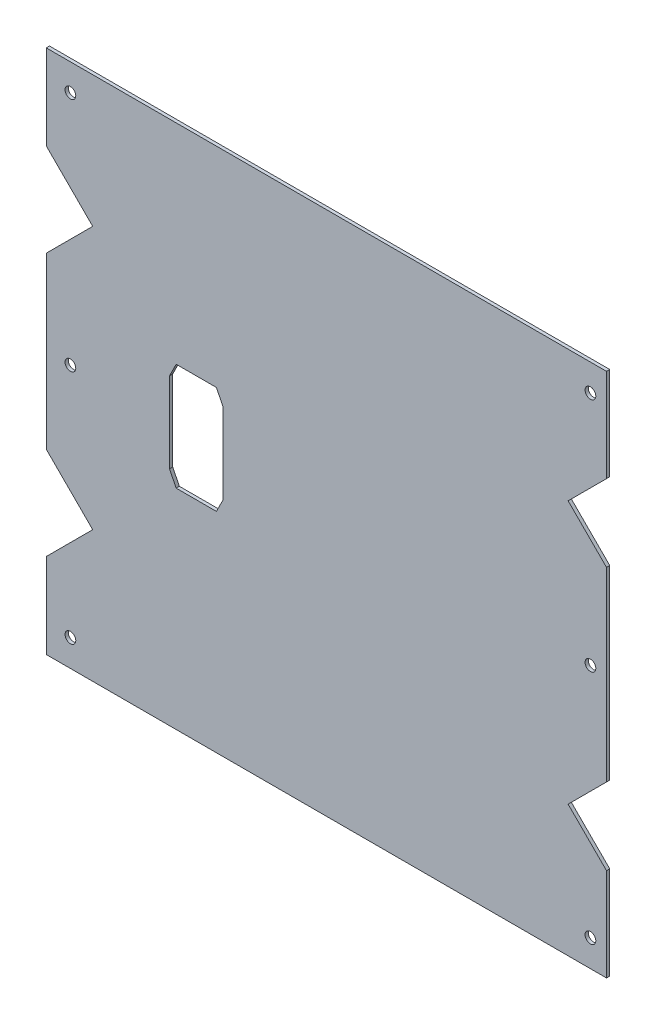
ISO-10303-21;
HEADER;
FILE_DESCRIPTION(('STEP AP214'),'2;1');
FILE_NAME('part.step','',(''),(''),'','','');
FILE_SCHEMA(('AUTOMOTIVE_DESIGN { 1 0 10303 214 1 1 1 1 }'));
ENDSEC;
DATA;
#1=APPLICATION_CONTEXT('core data for automotive mechanical design processes');
#2=APPLICATION_PROTOCOL_DEFINITION('international standard','automotive_design',2000,#1);
#3=PRODUCT_CONTEXT('',#1,'mechanical');
#4=PRODUCT('Part','Part','',(#3));
#5=PRODUCT_RELATED_PRODUCT_CATEGORY('part','',(#4));
#6=PRODUCT_DEFINITION_FORMATION('','',#4);
#7=PRODUCT_DEFINITION_CONTEXT('part definition',#1,'design');
#8=PRODUCT_DEFINITION('design','',#6,#7);
#9=PRODUCT_DEFINITION_SHAPE('','',#8);
#10=(LENGTH_UNIT() NAMED_UNIT(*) SI_UNIT(.MILLI.,.METRE.));
#11=(NAMED_UNIT(*) PLANE_ANGLE_UNIT() SI_UNIT($,.RADIAN.));
#12=(NAMED_UNIT(*) SI_UNIT($,.STERADIAN.) SOLID_ANGLE_UNIT());
#13=UNCERTAINTY_MEASURE_WITH_UNIT(LENGTH_MEASURE(1.E-05),#10,'distance_accuracy_value','');
#14=(GEOMETRIC_REPRESENTATION_CONTEXT(3) GLOBAL_UNCERTAINTY_ASSIGNED_CONTEXT((#13)) GLOBAL_UNIT_ASSIGNED_CONTEXT((#10,
#11,#12)) REPRESENTATION_CONTEXT('',''));
#15=CARTESIAN_POINT('',(0.,0.,0.));
#16=DIRECTION('',(0.,0.,1.));
#17=DIRECTION('',(1.,0.,0.));
#18=AXIS2_PLACEMENT_3D('',#15,#16,#17);
#19=CARTESIAN_POINT('',(0.,0.,-1.2));
#20=DIRECTION('',(0.,0.,-1.));
#21=DIRECTION('',(-1.,0.,0.));
#22=AXIS2_PLACEMENT_3D('',#19,#20,#21);
#23=PLANE('',#22);
#24=DIRECTION('',(0.707106781186546,0.707106781186549,0.));
#25=VECTOR('',#24,1.);
#26=CARTESIAN_POINT('',(-112.74800186836,24.8232233047034,-1.19999999999985));
#27=LINE('',#26,#25);
#28=CARTESIAN_POINT('',(-105.924778563656,31.6464466094066,-1.19999999999988));
#29=VERTEX_POINT('',#28);
#30=CARTESIAN_POINT('',(-88.6088358912349,48.9623892818282,-1.2));
#31=VERTEX_POINT('',#30);
#32=EDGE_CURVE('E1218',#29,#31,#27,.T.);
#33=ORIENTED_EDGE('',*,*,#32,.T.);
#34=DIRECTION('',(0.707106781186546,-0.707106781186549,0.));
#35=VECTOR('',#34,1.);
#36=CARTESIAN_POINT('',(-112.748001868359,73.1015552589529,-1.19999999999972));
#37=LINE('',#36,#35);
#38=CARTESIAN_POINT('',(-105.924778563656,66.2783319542498,-1.19999999999982));
#39=VERTEX_POINT('',#38);
#40=EDGE_CURVE('E1199',#39,#31,#37,.T.);
#41=ORIENTED_EDGE('',*,*,#40,.F.);
#42=DIRECTION('',(0.,-1.,0.));
#43=VECTOR('',#42,1.);
#44=CARTESIAN_POINT('',(-105.924778563656,47.9247785636563,-1.19999999999994));
#45=LINE('',#44,#43);
#46=CARTESIAN_POINT('',(-105.924778563656,97.9247785636565,-1.1999999999996));
#47=VERTEX_POINT('',#46);
#48=EDGE_CURVE('E1214',#39,#47,#45,.F.);
#49=ORIENTED_EDGE('',*,*,#48,.T.);
#50=DIRECTION('',(-1.,0.,0.));
#51=VECTOR('',#50,1.);
#52=CARTESIAN_POINT('',(137.924778563656,97.9247785636564,-1.19999999999937));
#53=LINE('',#52,#51);
#54=CARTESIAN_POINT('',(102.924778563656,97.9247785636564,-1.1999999999996));
#55=VERTEX_POINT('',#54);
#56=EDGE_CURVE('E1235',#47,#55,#53,.F.);
#57=ORIENTED_EDGE('',*,*,#56,.T.);
#58=DIRECTION('',(0.,1.,0.));
#59=VECTOR('',#58,1.);
#60=CARTESIAN_POINT('',(102.924778563656,47.9247785636563,-1.19999999999994));
#61=LINE('',#60,#59);
#62=CARTESIAN_POINT('',(102.924778563656,63.2783319542498,-1.19999999999983));
#63=VERTEX_POINT('',#62);
#64=EDGE_CURVE('E1229',#55,#63,#61,.F.);
#65=ORIENTED_EDGE('',*,*,#64,.T.);
#66=DIRECTION('',(0.707106781186546,0.707106781186549,0.));
#67=VECTOR('',#66,1.);
#68=CARTESIAN_POINT('',(112.748001868359,73.1015552589529,-1.19999999999969));
#69=LINE('',#68,#67);
#70=CARTESIAN_POINT('',(88.6088358912349,48.9623892818282,-1.20000000000002));
#71=VERTEX_POINT('',#70);
#72=EDGE_CURVE('E1223',#71,#63,#69,.T.);
#73=ORIENTED_EDGE('',*,*,#72,.F.);
#74=DIRECTION('',(0.707106781186546,-0.707106781186549,0.));
#75=VECTOR('',#74,1.);
#76=CARTESIAN_POINT('',(112.74800186836,24.8232233047034,-1.19999999999987));
#77=LINE('',#76,#75);
#78=CARTESIAN_POINT('',(102.924778563656,34.6464466094066,-1.19999999999994));
#79=VERTEX_POINT('',#78);
#80=EDGE_CURVE('E1321',#71,#79,#77,.T.);
#81=ORIENTED_EDGE('',*,*,#80,.T.);
#82=DIRECTION('',(0.,-1.,0.));
#83=VECTOR('',#82,1.);
#84=CARTESIAN_POINT('',(102.924778563656,0.,-1.19999999999994));
#85=LINE('',#84,#83);
#86=CARTESIAN_POINT('',(102.924778563656,-34.6464466094067,-1.19999999999997));
#87=VERTEX_POINT('',#86);
#88=EDGE_CURVE('E1327',#79,#87,#85,.T.);
#89=ORIENTED_EDGE('',*,*,#88,.T.);
#90=DIRECTION('',(-0.707106781186546,-0.707106781186549,0.));
#91=VECTOR('',#90,1.);
#92=CARTESIAN_POINT('',(112.74800186836,-24.8232233047034,-1.19999999999988));
#93=LINE('',#92,#91);
#94=CARTESIAN_POINT('',(88.6088358912349,-48.9623892818282,-1.20000000000005));
#95=VERTEX_POINT('',#94);
#96=EDGE_CURVE('E1324',#87,#95,#93,.T.);
#97=ORIENTED_EDGE('',*,*,#96,.T.);
#98=DIRECTION('',(0.707106781186546,-0.707106781186549,0.));
#99=VECTOR('',#98,1.);
#100=CARTESIAN_POINT('',(112.748001868359,-73.1015552589529,-1.19999999999969));
#101=LINE('',#100,#99);
#102=CARTESIAN_POINT('',(102.924778563656,-63.2783319542498,-1.19999999999984));
#103=VERTEX_POINT('',#102);
#104=EDGE_CURVE('E1279',#95,#103,#101,.T.);
#105=ORIENTED_EDGE('',*,*,#104,.T.);
#106=DIRECTION('',(0.,-1.,0.));
#107=VECTOR('',#106,1.);
#108=CARTESIAN_POINT('',(102.924778563656,-47.9247785636563,-1.19999999999995));
#109=LINE('',#108,#107);
#110=CARTESIAN_POINT('',(102.924778563656,-97.9247785636565,-1.1999999999996));
#111=VERTEX_POINT('',#110);
#112=EDGE_CURVE('E1276',#103,#111,#109,.T.);
#113=ORIENTED_EDGE('',*,*,#112,.T.);
#114=DIRECTION('',(-1.,0.,0.));
#115=VECTOR('',#114,1.);
#116=CARTESIAN_POINT('',(137.924778563656,-97.9247785636564,-1.19999999999936));
#117=LINE('',#116,#115);
#118=CARTESIAN_POINT('',(-105.924778563656,-97.9247785636565,-1.19999999999955));
#119=VERTEX_POINT('',#118);
#120=EDGE_CURVE('E1273',#111,#119,#117,.T.);
#121=ORIENTED_EDGE('',*,*,#120,.T.);
#122=DIRECTION('',(0.,1.,0.));
#123=VECTOR('',#122,1.);
#124=CARTESIAN_POINT('',(-105.924778563656,-47.9247785636563,-1.19999999999989));
#125=LINE('',#124,#123);
#126=CARTESIAN_POINT('',(-105.924778563656,-66.2783319542498,-1.19999999999976));
#127=VERTEX_POINT('',#126);
#128=EDGE_CURVE('E1270',#119,#127,#125,.T.);
#129=ORIENTED_EDGE('',*,*,#128,.T.);
#130=DIRECTION('',(0.707106781186546,0.707106781186549,0.));
#131=VECTOR('',#130,1.);
#132=CARTESIAN_POINT('',(-112.748001868359,-73.1015552589528,-1.19999999999966));
#133=LINE('',#132,#131);
#134=CARTESIAN_POINT('',(-88.6088358912349,-48.9623892818282,-1.19999999999999));
#135=VERTEX_POINT('',#134);
#136=EDGE_CURVE('E1267',#127,#135,#133,.T.);
#137=ORIENTED_EDGE('',*,*,#136,.T.);
#138=DIRECTION('',(-0.707106781186546,0.707106781186549,0.));
#139=VECTOR('',#138,1.);
#140=CARTESIAN_POINT('',(-112.74800186836,-24.8232233047034,-1.19999999999987));
#141=LINE('',#140,#139);
#142=CARTESIAN_POINT('',(-105.924778563656,-31.6464466094066,-1.19999999999991));
#143=VERTEX_POINT('',#142);
#144=EDGE_CURVE('E1352',#135,#143,#141,.T.);
#145=ORIENTED_EDGE('',*,*,#144,.T.);
#146=DIRECTION('',(0.,1.,0.));
#147=VECTOR('',#146,1.);
#148=CARTESIAN_POINT('',(-105.924778563656,0.,-1.1999999999999));
#149=LINE('',#148,#147);
#150=EDGE_CURVE('E1356',#143,#29,#149,.T.);
#151=ORIENTED_EDGE('',*,*,#150,.T.);
#152=EDGE_LOOP('',(#33,#41,#49,#57,#65,#73,#81,#89,#97,#105,#113,#121,#129,#137,#145,#151));
#153=FACE_BOUND('',#152,.T.);
#154=DIRECTION('',(1.,0.,0.));
#155=VECTOR('',#154,1.);
#156=CARTESIAN_POINT('',(0.,20.,-1.2));
#157=LINE('',#156,#155);
#158=CARTESIAN_POINT('',(-57.5,20.,-1.2));
#159=VERTEX_POINT('',#158);
#160=CARTESIAN_POINT('',(-42.5,20.,-1.2));
#161=VERTEX_POINT('',#160);
#162=EDGE_CURVE('E618',#159,#161,#157,.T.);
#163=ORIENTED_EDGE('',*,*,#162,.F.);
#164=DIRECTION('',(0.447213595499958,0.894427190999916,0.));
#165=VECTOR('',#164,1.);
#166=CARTESIAN_POINT('',(-54.,27.,-1.2));
#167=LINE('',#166,#165);
#168=CARTESIAN_POINT('',(-60.,15.,-1.20000000000001));
#169=VERTEX_POINT('',#168);
#170=EDGE_CURVE('E654',#169,#159,#167,.T.);
#171=ORIENTED_EDGE('',*,*,#170,.F.);
#172=DIRECTION('',(0.,1.,0.));
#173=VECTOR('',#172,1.);
#174=CARTESIAN_POINT('',(-60.,0.,-1.2));
#175=LINE('',#174,#173);
#176=CARTESIAN_POINT('',(-60.,-15.,-1.2));
#177=VERTEX_POINT('',#176);
#178=EDGE_CURVE('E656',#177,#169,#175,.T.);
#179=ORIENTED_EDGE('',*,*,#178,.F.);
#180=DIRECTION('',(-0.447213595499958,0.894427190999916,0.));
#181=VECTOR('',#180,1.);
#182=CARTESIAN_POINT('',(-54.,-27.,-1.2));
#183=LINE('',#182,#181);
#184=CARTESIAN_POINT('',(-57.5,-20.,-1.2));
#185=VERTEX_POINT('',#184);
#186=EDGE_CURVE('E672',#185,#177,#183,.T.);
#187=ORIENTED_EDGE('',*,*,#186,.F.);
#188=DIRECTION('',(-1.,0.,0.));
#189=VECTOR('',#188,1.);
#190=CARTESIAN_POINT('',(0.,-20.,-1.2));
#191=LINE('',#190,#189);
#192=CARTESIAN_POINT('',(-42.5,-20.,-1.2));
#193=VERTEX_POINT('',#192);
#194=EDGE_CURVE('E675',#193,#185,#191,.T.);
#195=ORIENTED_EDGE('',*,*,#194,.F.);
#196=DIRECTION('',(-0.447213595499958,-0.894427190999916,0.));
#197=VECTOR('',#196,1.);
#198=CARTESIAN_POINT('',(-26.,13.,-1.2));
#199=LINE('',#198,#197);
#200=CARTESIAN_POINT('',(-40.,-15.,-1.20000000000001));
#201=VERTEX_POINT('',#200);
#202=EDGE_CURVE('E677',#201,#193,#199,.T.);
#203=ORIENTED_EDGE('',*,*,#202,.F.);
#204=DIRECTION('',(0.,-1.,0.));
#205=VECTOR('',#204,1.);
#206=CARTESIAN_POINT('',(-40.,0.,-1.2));
#207=LINE('',#206,#205);
#208=CARTESIAN_POINT('',(-40.,15.,-1.2));
#209=VERTEX_POINT('',#208);
#210=EDGE_CURVE('E605',#209,#201,#207,.T.);
#211=ORIENTED_EDGE('',*,*,#210,.F.);
#212=DIRECTION('',(0.447213595499958,-0.894427190999916,0.));
#213=VECTOR('',#212,1.);
#214=CARTESIAN_POINT('',(-26.,-13.,-1.2));
#215=LINE('',#214,#213);
#216=EDGE_CURVE('E621',#161,#209,#215,.T.);
#217=ORIENTED_EDGE('',*,*,#216,.F.);
#218=EDGE_LOOP('',(#163,#171,#179,#187,#195,#203,#211,#217));
#219=FACE_BOUND('',#218,.T.);
#220=CARTESIAN_POINT('',(-96.9247785636564,-1.2490009027033E-13,-1.19999999999997));
#221=DIRECTION('',(0.,0.,-1.));
#222=DIRECTION('',(-1.,0.,0.));
#223=AXIS2_PLACEMENT_3D('',#220,#221,#222);
#224=CIRCLE('',#223,2.);
#225=CARTESIAN_POINT('',(-98.9247785636564,-1.2490009027033E-13,-1.19999999999995));
#226=VERTEX_POINT('',#225);
#227=EDGE_CURVE('E1358',#226,#226,#224,.T.);
#228=ORIENTED_EDGE('',*,*,#227,.F.);
#229=EDGE_LOOP('',(#228));
#230=FACE_BOUND('',#229,.T.);
#231=CARTESIAN_POINT('',(96.9247785636564,-1.25290403052425E-13,-1.19999999999999));
#232=DIRECTION('',(0.,0.,-1.));
#233=DIRECTION('',(-1.,0.,0.));
#234=AXIS2_PLACEMENT_3D('',#231,#232,#233);
#235=CIRCLE('',#234,2.);
#236=CARTESIAN_POINT('',(94.9247785636564,-1.24856722183431E-13,-1.20000000000001));
#237=VERTEX_POINT('',#236);
#238=EDGE_CURVE('E1333',#237,#237,#235,.T.);
#239=ORIENTED_EDGE('',*,*,#238,.F.);
#240=EDGE_LOOP('',(#239));
#241=FACE_BOUND('',#240,.T.);
#242=CARTESIAN_POINT('',(-96.9247785636564,-87.9247785636565,-1.19999999999967));
#243=DIRECTION('',(0.,0.,-1.));
#244=DIRECTION('',(-1.,0.,0.));
#245=AXIS2_PLACEMENT_3D('',#242,#243,#244);
#246=CIRCLE('',#245,2.);
#247=CARTESIAN_POINT('',(-98.9247785636564,-87.9247785636564,-1.19999999999965));
#248=VERTEX_POINT('',#247);
#249=EDGE_CURVE('E1306',#248,#248,#246,.T.);
#250=ORIENTED_EDGE('',*,*,#249,.F.);
#251=EDGE_LOOP('',(#250));
#252=FACE_BOUND('',#251,.T.);
#253=CARTESIAN_POINT('',(96.9247785636564,-87.9247785636565,-1.19999999999967));
#254=DIRECTION('',(0.,0.,-1.));
#255=DIRECTION('',(-1.,0.,0.));
#256=AXIS2_PLACEMENT_3D('',#253,#254,#255);
#257=CIRCLE('',#256,2.);
#258=CARTESIAN_POINT('',(94.9247785636564,-87.9247785636565,-1.19999999999969));
#259=VERTEX_POINT('',#258);
#260=EDGE_CURVE('E1312',#259,#259,#257,.T.);
#261=ORIENTED_EDGE('',*,*,#260,.F.);
#262=EDGE_LOOP('',(#261));
#263=FACE_BOUND('',#262,.T.);
#264=CARTESIAN_POINT('',(-96.9247785636565,87.9247785636564,-1.19999999999973));
#265=DIRECTION('',(0.,0.,1.));
#266=DIRECTION('',(-1.,0.,0.));
#267=AXIS2_PLACEMENT_3D('',#264,#265,#266);
#268=CIRCLE('',#267,2.);
#269=CARTESIAN_POINT('',(-98.9247785636565,87.9247785636564,-1.19999999999972));
#270=VERTEX_POINT('',#269);
#271=EDGE_CURVE('E1224',#270,#270,#268,.T.);
#272=ORIENTED_EDGE('',*,*,#271,.T.);
#273=EDGE_LOOP('',(#272));
#274=FACE_BOUND('',#273,.T.);
#275=CARTESIAN_POINT('',(96.9247785636565,87.9247785636564,-1.19999999999967));
#276=DIRECTION('',(0.,0.,1.));
#277=DIRECTION('',(-1.,0.,0.));
#278=AXIS2_PLACEMENT_3D('',#275,#276,#277);
#279=CIRCLE('',#278,2.);
#280=CARTESIAN_POINT('',(94.9247785636565,87.9247785636564,-1.19999999999968));
#281=VERTEX_POINT('',#280);
#282=EDGE_CURVE('E1237',#281,#281,#279,.T.);
#283=ORIENTED_EDGE('',*,*,#282,.T.);
#284=EDGE_LOOP('',(#283));
#285=FACE_BOUND('',#284,.T.);
#286=ADVANCED_FACE('F538',(#153,#219,#230,#241,#252,#263,#274,#285),#23,.T.);
#287=CARTESIAN_POINT('',(0.,0.,0.));
#288=DIRECTION('',(0.,0.,-1.));
#289=DIRECTION('',(-1.,0.,0.));
#290=AXIS2_PLACEMENT_3D('',#287,#288,#289);
#291=PLANE('',#290);
#292=DIRECTION('',(-0.707106781186546,0.707106781186549,0.));
#293=VECTOR('',#292,1.);
#294=CARTESIAN_POINT('',(-90.1247785636564,50.4783319542497,0.));
#295=LINE('',#294,#293);
#296=CARTESIAN_POINT('',(-88.6088358912349,48.9623892818282,0.));
#297=VERTEX_POINT('',#296);
#298=CARTESIAN_POINT('',(-105.924778563656,66.2783319542498,2.0122792321331E-13));
#299=VERTEX_POINT('',#298);
#300=EDGE_CURVE('E1203',#297,#299,#295,.T.);
#301=ORIENTED_EDGE('',*,*,#300,.F.);
#302=DIRECTION('',(0.707106781186547,0.707106781186549,0.));
#303=VECTOR('',#302,1.);
#304=CARTESIAN_POINT('',(-158.153232843601,-20.5820076705384,4.44089209850063E-13));
#305=LINE('',#304,#303);
#306=CARTESIAN_POINT('',(-105.924778563656,31.6464466094066,1.2490009027033E-13));
#307=VERTEX_POINT('',#306);
#308=EDGE_CURVE('E667',#307,#297,#305,.T.);
#309=ORIENTED_EDGE('',*,*,#308,.F.);
#310=DIRECTION('',(0.,-1.,0.));
#311=VECTOR('',#310,1.);
#312=CARTESIAN_POINT('',(-105.924778563656,-47.8,0.));
#313=LINE('',#312,#311);
#314=CARTESIAN_POINT('',(-105.924778563656,-31.6464466094066,0.));
#315=VERTEX_POINT('',#314);
#316=EDGE_CURVE('E661',#315,#307,#313,.F.);
#317=ORIENTED_EDGE('',*,*,#316,.F.);
#318=DIRECTION('',(-0.707106781186546,0.707106781186549,0.));
#319=VECTOR('',#318,1.);
#320=CARTESIAN_POINT('',(-90.1247785636564,-47.4464466094067,0.));
#321=LINE('',#320,#319);
#322=CARTESIAN_POINT('',(-88.6088358912349,-48.9623892818282,0.));
#323=VERTEX_POINT('',#322);
#324=EDGE_CURVE('E1349',#323,#315,#321,.T.);
#325=ORIENTED_EDGE('',*,*,#324,.F.);
#326=DIRECTION('',(0.707106781186546,0.707106781186549,0.));
#327=VECTOR('',#326,1.);
#328=CARTESIAN_POINT('',(-125.495990699087,-85.8495440896806,4.9960036108132E-13));
#329=LINE('',#328,#327);
#330=CARTESIAN_POINT('',(-105.924778563656,-66.2783319542498,2.4980018054066E-13));
#331=VERTEX_POINT('',#330);
#332=EDGE_CURVE('E1264',#331,#323,#329,.T.);
#333=ORIENTED_EDGE('',*,*,#332,.F.);
#334=DIRECTION('',(0.,-1.,0.));
#335=VECTOR('',#334,1.);
#336=CARTESIAN_POINT('',(-105.924778563656,-97.9247785636564,4.57966997657877E-13));
#337=LINE('',#336,#335);
#338=CARTESIAN_POINT('',(-105.924778563656,-97.9247785636564,4.57966997657877E-13));
#339=VERTEX_POINT('',#338);
#340=EDGE_CURVE('E1297',#339,#331,#337,.F.);
#341=ORIENTED_EDGE('',*,*,#340,.F.);
#342=DIRECTION('',(1.,0.,0.));
#343=VECTOR('',#342,1.);
#344=CARTESIAN_POINT('',(102.924778563656,-97.9247785636565,4.09394740330526E-13));
#345=LINE('',#344,#343);
#346=CARTESIAN_POINT('',(102.924778563656,-97.9247785636565,4.09394740330526E-13));
#347=VERTEX_POINT('',#346);
#348=EDGE_CURVE('E1303',#347,#339,#345,.F.);
#349=ORIENTED_EDGE('',*,*,#348,.F.);
#350=DIRECTION('',(0.,1.,0.));
#351=VECTOR('',#350,1.);
#352=CARTESIAN_POINT('',(102.924778563656,-50.1247785636564,0.));
#353=LINE('',#352,#351);
#354=CARTESIAN_POINT('',(102.924778563656,-63.2783319542498,1.66533453693773E-13));
#355=VERTEX_POINT('',#354);
#356=EDGE_CURVE('E1285',#355,#347,#353,.F.);
#357=ORIENTED_EDGE('',*,*,#356,.F.);
#358=DIRECTION('',(0.707106781186546,-0.707106781186549,0.));
#359=VECTOR('',#358,1.);
#360=CARTESIAN_POINT('',(90.1247785636564,-50.4783319542497,0.));
#361=LINE('',#360,#359);
#362=CARTESIAN_POINT('',(88.6088358912349,-48.9623892818282,0.));
#363=VERTEX_POINT('',#362);
#364=EDGE_CURVE('E1260',#363,#355,#361,.T.);
#365=ORIENTED_EDGE('',*,*,#364,.F.);
#366=DIRECTION('',(-0.707106781186546,-0.707106781186549,0.));
#367=VECTOR('',#366,1.);
#368=CARTESIAN_POINT('',(157.837189477155,20.2659643040926,4.30211422042248E-13));
#369=LINE('',#368,#367);
#370=CARTESIAN_POINT('',(102.924778563656,-34.6464466094067,0.));
#371=VERTEX_POINT('',#370);
#372=EDGE_CURVE('E1315',#371,#363,#369,.T.);
#373=ORIENTED_EDGE('',*,*,#372,.F.);
#374=DIRECTION('',(0.,1.,0.));
#375=VECTOR('',#374,1.);
#376=CARTESIAN_POINT('',(102.924778563656,47.8,0.));
#377=LINE('',#376,#375);
#378=CARTESIAN_POINT('',(102.924778563656,34.6464466094066,0.));
#379=VERTEX_POINT('',#378);
#380=EDGE_CURVE('E1263',#379,#371,#377,.F.);
#381=ORIENTED_EDGE('',*,*,#380,.F.);
#382=DIRECTION('',(0.707106781186546,-0.707106781186549,0.));
#383=VECTOR('',#382,1.);
#384=CARTESIAN_POINT('',(90.1247785636564,47.4464466094067,0.));
#385=LINE('',#384,#383);
#386=CARTESIAN_POINT('',(88.6088358912349,48.9623892818282,0.));
#387=VERTEX_POINT('',#386);
#388=EDGE_CURVE('E1318',#387,#379,#385,.T.);
#389=ORIENTED_EDGE('',*,*,#388,.F.);
#390=DIRECTION('',(-0.707106781186546,-0.707106781186549,0.));
#391=VECTOR('',#390,1.);
#392=CARTESIAN_POINT('',(124.884275797213,85.2378291878066,4.71844785465692E-13));
#393=LINE('',#392,#391);
#394=CARTESIAN_POINT('',(102.924778563656,63.2783319542498,1.73472347597681E-13));
#395=VERTEX_POINT('',#394);
#396=EDGE_CURVE('E1219',#395,#387,#393,.T.);
#397=ORIENTED_EDGE('',*,*,#396,.F.);
#398=DIRECTION('',(0.,-1.,0.));
#399=VECTOR('',#398,1.);
#400=CARTESIAN_POINT('',(102.924778563656,50.1247785636563,0.));
#401=LINE('',#400,#399);
#402=CARTESIAN_POINT('',(102.924778563656,97.9247785636564,4.02455846426619E-13));
#403=VERTEX_POINT('',#402);
#404=EDGE_CURVE('E1247',#403,#395,#401,.T.);
#405=ORIENTED_EDGE('',*,*,#404,.F.);
#406=DIRECTION('',(1.,0.,0.));
#407=VECTOR('',#406,1.);
#408=CARTESIAN_POINT('',(102.924778563656,97.9247785636564,4.02455846426619E-13));
#409=LINE('',#408,#407);
#410=CARTESIAN_POINT('',(-105.924778563656,97.9247785636564,4.09394740330526E-13));
#411=VERTEX_POINT('',#410);
#412=EDGE_CURVE('E1253',#411,#403,#409,.T.);
#413=ORIENTED_EDGE('',*,*,#412,.F.);
#414=DIRECTION('',(0.,1.,0.));
#415=VECTOR('',#414,1.);
#416=CARTESIAN_POINT('',(-105.924778563656,97.9247785636564,4.09394740330526E-13));
#417=LINE('',#416,#415);
#418=EDGE_CURVE('E1209',#299,#411,#417,.T.);
#419=ORIENTED_EDGE('',*,*,#418,.F.);
#420=EDGE_LOOP('',(#301,#309,#317,#325,#333,#341,#349,#357,#365,#373,#381,#389,#397,#405,#413,#419));
#421=FACE_BOUND('',#420,.T.);
#422=DIRECTION('',(0.447213595499958,0.894427190999916,0.));
#423=VECTOR('',#422,1.);
#424=CARTESIAN_POINT('',(-54.,27.,0.));
#425=LINE('',#424,#423);
#426=CARTESIAN_POINT('',(-60.,15.,0.));
#427=VERTEX_POINT('',#426);
#428=CARTESIAN_POINT('',(-57.5,20.,0.));
#429=VERTEX_POINT('',#428);
#430=EDGE_CURVE('E614',#427,#429,#425,.T.);
#431=ORIENTED_EDGE('',*,*,#430,.T.);
#432=DIRECTION('',(1.,0.,0.));
#433=VECTOR('',#432,1.);
#434=CARTESIAN_POINT('',(0.,20.,0.));
#435=LINE('',#434,#433);
#436=CARTESIAN_POINT('',(-42.5,20.,0.));
#437=VERTEX_POINT('',#436);
#438=EDGE_CURVE('E13',#429,#437,#435,.T.);
#439=ORIENTED_EDGE('',*,*,#438,.T.);
#440=DIRECTION('',(0.447213595499958,-0.894427190999916,0.));
#441=VECTOR('',#440,1.);
#442=CARTESIAN_POINT('',(-26.,-13.,0.));
#443=LINE('',#442,#441);
#444=CARTESIAN_POINT('',(-40.,15.,0.));
#445=VERTEX_POINT('',#444);
#446=EDGE_CURVE('E548',#437,#445,#443,.T.);
#447=ORIENTED_EDGE('',*,*,#446,.T.);
#448=DIRECTION('',(0.,1.,0.));
#449=VECTOR('',#448,1.);
#450=CARTESIAN_POINT('',(-40.,0.,0.));
#451=LINE('',#450,#449);
#452=CARTESIAN_POINT('',(-40.,-15.,0.));
#453=VERTEX_POINT('',#452);
#454=EDGE_CURVE('E542',#445,#453,#451,.F.);
#455=ORIENTED_EDGE('',*,*,#454,.T.);
#456=DIRECTION('',(-0.447213595499958,-0.894427190999916,0.));
#457=VECTOR('',#456,1.);
#458=CARTESIAN_POINT('',(-26.,13.,0.));
#459=LINE('',#458,#457);
#460=CARTESIAN_POINT('',(-42.5,-20.,0.));
#461=VERTEX_POINT('',#460);
#462=EDGE_CURVE('E585',#453,#461,#459,.T.);
#463=ORIENTED_EDGE('',*,*,#462,.T.);
#464=DIRECTION('',(-1.,0.,0.));
#465=VECTOR('',#464,1.);
#466=CARTESIAN_POINT('',(0.,-20.,0.));
#467=LINE('',#466,#465);
#468=CARTESIAN_POINT('',(-57.5,-20.,0.));
#469=VERTEX_POINT('',#468);
#470=EDGE_CURVE('E598',#461,#469,#467,.T.);
#471=ORIENTED_EDGE('',*,*,#470,.T.);
#472=DIRECTION('',(-0.447213595499958,0.894427190999916,0.));
#473=VECTOR('',#472,1.);
#474=CARTESIAN_POINT('',(-54.,-27.,0.));
#475=LINE('',#474,#473);
#476=CARTESIAN_POINT('',(-60.,-15.,0.));
#477=VERTEX_POINT('',#476);
#478=EDGE_CURVE('E613',#469,#477,#475,.T.);
#479=ORIENTED_EDGE('',*,*,#478,.T.);
#480=DIRECTION('',(0.,1.,0.));
#481=VECTOR('',#480,1.);
#482=CARTESIAN_POINT('',(-60.,0.,0.));
#483=LINE('',#482,#481);
#484=EDGE_CURVE('E611',#477,#427,#483,.T.);
#485=ORIENTED_EDGE('',*,*,#484,.T.);
#486=EDGE_LOOP('',(#431,#439,#447,#455,#463,#471,#479,#485));
#487=FACE_BOUND('',#486,.T.);
#488=CARTESIAN_POINT('',(-96.9247785636564,-1.2490009027033E-13,0.));
#489=DIRECTION('',(0.,0.,-1.));
#490=DIRECTION('',(-1.,0.,0.));
#491=AXIS2_PLACEMENT_3D('',#488,#489,#490);
#492=CIRCLE('',#491,2.);
#493=CARTESIAN_POINT('',(-98.9247785636564,-1.2490009027033E-13,0.));
#494=VERTEX_POINT('',#493);
#495=EDGE_CURVE('E1346',#494,#494,#492,.T.);
#496=ORIENTED_EDGE('',*,*,#495,.T.);
#497=EDGE_LOOP('',(#496));
#498=FACE_BOUND('',#497,.T.);
#499=CARTESIAN_POINT('',(96.9247785636564,-1.25550611573821E-13,0.));
#500=DIRECTION('',(0.,0.,1.));
#501=DIRECTION('',(1.,0.,0.));
#502=AXIS2_PLACEMENT_3D('',#499,#500,#501);
#503=CIRCLE('',#502,2.);
#504=CARTESIAN_POINT('',(98.9247785636564,-1.25984292442816E-13,0.));
#505=VERTEX_POINT('',#504);
#506=EDGE_CURVE('E1330',#505,#505,#503,.T.);
#507=ORIENTED_EDGE('',*,*,#506,.F.);
#508=EDGE_LOOP('',(#507));
#509=FACE_BOUND('',#508,.T.);
#510=CARTESIAN_POINT('',(96.9247785636564,-87.9247785636565,3.46944695195361E-13));
#511=DIRECTION('',(0.,0.,1.));
#512=DIRECTION('',(0.,-1.,0.));
#513=AXIS2_PLACEMENT_3D('',#510,#511,#512);
#514=CIRCLE('',#513,2.);
#515=CARTESIAN_POINT('',(96.9247785636564,-89.9247785636565,3.60866551776955E-13));
#516=VERTEX_POINT('',#515);
#517=EDGE_CURVE('E1309',#516,#516,#514,.T.);
#518=ORIENTED_EDGE('',*,*,#517,.F.);
#519=EDGE_LOOP('',(#518));
#520=FACE_BOUND('',#519,.T.);
#521=CARTESIAN_POINT('',(-96.9247785636564,-87.9247785636565,3.95516952522712E-13));
#522=DIRECTION('',(0.,0.,-1.));
#523=DIRECTION('',(0.,-1.,0.));
#524=AXIS2_PLACEMENT_3D('',#521,#522,#523);
#525=CIRCLE('',#524,2.);
#526=CARTESIAN_POINT('',(-96.9247785636564,-89.9247785636565,4.09438809104305E-13));
#527=VERTEX_POINT('',#526);
#528=EDGE_CURVE('E1291',#527,#527,#525,.T.);
#529=ORIENTED_EDGE('',*,*,#528,.T.);
#530=EDGE_LOOP('',(#529));
#531=FACE_BOUND('',#530,.T.);
#532=CARTESIAN_POINT('',(-96.9247785636565,87.9247785636564,3.46944695195361E-13));
#533=DIRECTION('',(0.,0.,-1.));
#534=DIRECTION('',(0.,1.,0.));
#535=AXIS2_PLACEMENT_3D('',#532,#533,#534);
#536=CIRCLE('',#535,2.);
#537=CARTESIAN_POINT('',(-96.9247785636565,89.9247785636564,3.60866551776955E-13));
#538=VERTEX_POINT('',#537);
#539=EDGE_CURVE('E1240',#538,#538,#536,.T.);
#540=ORIENTED_EDGE('',*,*,#539,.T.);
#541=EDGE_LOOP('',(#540));
#542=FACE_BOUND('',#541,.T.);
#543=CARTESIAN_POINT('',(96.9247785636565,87.9247785636564,3.53883589099269E-13));
#544=DIRECTION('',(0.,0.,1.));
#545=DIRECTION('',(0.,1.,0.));
#546=AXIS2_PLACEMENT_3D('',#543,#544,#545);
#547=CIRCLE('',#546,2.);
#548=CARTESIAN_POINT('',(96.9247785636565,89.9247785636564,3.67805445680862E-13));
#549=VERTEX_POINT('',#548);
#550=EDGE_CURVE('E1256',#549,#549,#547,.T.);
#551=ORIENTED_EDGE('',*,*,#550,.F.);
#552=EDGE_LOOP('',(#551));
#553=FACE_BOUND('',#552,.T.);
#554=ADVANCED_FACE('F540',(#421,#487,#498,#509,#520,#531,#542,#553),#291,.F.);
#555=CARTESIAN_POINT('',(-42.5,20.,-50.0000000000001));
#556=DIRECTION('',(0.,1.,0.));
#557=DIRECTION('',(0.,0.,1.));
#558=AXIS2_PLACEMENT_3D('',#555,#556,#557);
#559=PLANE('',#558);
#560=ORIENTED_EDGE('',*,*,#162,.T.);
#561=DIRECTION('',(0.,0.,1.));
#562=VECTOR('',#561,1.);
#563=CARTESIAN_POINT('',(-42.5,20.,-50.0000000000001));
#564=LINE('',#563,#562);
#565=EDGE_CURVE('E647',#161,#437,#564,.T.);
#566=ORIENTED_EDGE('',*,*,#565,.T.);
#567=ORIENTED_EDGE('',*,*,#438,.F.);
#568=DIRECTION('',(0.,0.,1.));
#569=VECTOR('',#568,1.);
#570=CARTESIAN_POINT('',(-57.5,20.,-50.0000000000001));
#571=LINE('',#570,#569);
#572=EDGE_CURVE('E666',#159,#429,#571,.T.);
#573=ORIENTED_EDGE('',*,*,#572,.F.);
#574=EDGE_LOOP('',(#560,#566,#567,#573));
#575=FACE_BOUND('',#574,.T.);
#576=ADVANCED_FACE('F651',(#575),#559,.F.);
#577=CARTESIAN_POINT('',(-40.,15.,-50.0000000000001));
#578=DIRECTION('',(0.894427190999916,0.447213595499958,0.));
#579=DIRECTION('',(-0.447213595499958,0.894427190999916,0.));
#580=AXIS2_PLACEMENT_3D('',#577,#578,#579);
#581=PLANE('',#580);
#582=ORIENTED_EDGE('',*,*,#216,.T.);
#583=DIRECTION('',(0.,0.,1.));
#584=VECTOR('',#583,1.);
#585=CARTESIAN_POINT('',(-40.,15.,-50.0000000000001));
#586=LINE('',#585,#584);
#587=EDGE_CURVE('E576',#209,#445,#586,.T.);
#588=ORIENTED_EDGE('',*,*,#587,.T.);
#589=ORIENTED_EDGE('',*,*,#446,.F.);
#590=ORIENTED_EDGE('',*,*,#565,.F.);
#591=EDGE_LOOP('',(#582,#588,#589,#590));
#592=FACE_BOUND('',#591,.T.);
#593=ADVANCED_FACE('F646',(#592),#581,.F.);
#594=CARTESIAN_POINT('',(-40.,-15.,-50.0000000000001));
#595=DIRECTION('',(1.,0.,0.));
#596=DIRECTION('',(0.,0.,-1.));
#597=AXIS2_PLACEMENT_3D('',#594,#595,#596);
#598=PLANE('',#597);
#599=ORIENTED_EDGE('',*,*,#210,.T.);
#600=DIRECTION('',(0.,0.,1.));
#601=VECTOR('',#600,1.);
#602=CARTESIAN_POINT('',(-40.,-15.,-50.0000000000001));
#603=LINE('',#602,#601);
#604=EDGE_CURVE('E590',#201,#453,#603,.T.);
#605=ORIENTED_EDGE('',*,*,#604,.T.);
#606=ORIENTED_EDGE('',*,*,#454,.F.);
#607=ORIENTED_EDGE('',*,*,#587,.F.);
#608=EDGE_LOOP('',(#599,#605,#606,#607));
#609=FACE_BOUND('',#608,.T.);
#610=ADVANCED_FACE('F602',(#609),#598,.F.);
#611=CARTESIAN_POINT('',(-42.5,-20.,-50.0000000000001));
#612=DIRECTION('',(0.894427190999916,-0.447213595499958,0.));
#613=DIRECTION('',(0.447213595499958,0.894427190999916,0.));
#614=AXIS2_PLACEMENT_3D('',#611,#612,#613);
#615=PLANE('',#614);
#616=ORIENTED_EDGE('',*,*,#202,.T.);
#617=DIRECTION('',(0.,0.,1.));
#618=VECTOR('',#617,1.);
#619=CARTESIAN_POINT('',(-42.5,-20.,-50.0000000000001));
#620=LINE('',#619,#618);
#621=EDGE_CURVE('E594',#193,#461,#620,.T.);
#622=ORIENTED_EDGE('',*,*,#621,.T.);
#623=ORIENTED_EDGE('',*,*,#462,.F.);
#624=ORIENTED_EDGE('',*,*,#604,.F.);
#625=EDGE_LOOP('',(#616,#622,#623,#624));
#626=FACE_BOUND('',#625,.T.);
#627=ADVANCED_FACE('F588',(#626),#615,.F.);
#628=CARTESIAN_POINT('',(-57.5,-20.,-50.0000000000001));
#629=DIRECTION('',(0.,-1.,0.));
#630=DIRECTION('',(0.,0.,-1.));
#631=AXIS2_PLACEMENT_3D('',#628,#629,#630);
#632=PLANE('',#631);
#633=ORIENTED_EDGE('',*,*,#194,.T.);
#634=DIRECTION('',(0.,0.,1.));
#635=VECTOR('',#634,1.);
#636=CARTESIAN_POINT('',(-57.5,-20.,-50.0000000000001));
#637=LINE('',#636,#635);
#638=EDGE_CURVE('E636',#185,#469,#637,.T.);
#639=ORIENTED_EDGE('',*,*,#638,.T.);
#640=ORIENTED_EDGE('',*,*,#470,.F.);
#641=ORIENTED_EDGE('',*,*,#621,.F.);
#642=EDGE_LOOP('',(#633,#639,#640,#641));
#643=FACE_BOUND('',#642,.T.);
#644=ADVANCED_FACE('F633',(#643),#632,.F.);
#645=CARTESIAN_POINT('',(-60.,-15.,-50.0000000000001));
#646=DIRECTION('',(-0.894427190999916,-0.447213595499958,0.));
#647=DIRECTION('',(0.447213595499958,-0.894427190999916,0.));
#648=AXIS2_PLACEMENT_3D('',#645,#646,#647);
#649=PLANE('',#648);
#650=ORIENTED_EDGE('',*,*,#186,.T.);
#651=DIRECTION('',(0.,0.,1.));
#652=VECTOR('',#651,1.);
#653=CARTESIAN_POINT('',(-60.,-15.,-50.0000000000001));
#654=LINE('',#653,#652);
#655=EDGE_CURVE('E665',#177,#477,#654,.T.);
#656=ORIENTED_EDGE('',*,*,#655,.T.);
#657=ORIENTED_EDGE('',*,*,#478,.F.);
#658=ORIENTED_EDGE('',*,*,#638,.F.);
#659=EDGE_LOOP('',(#650,#656,#657,#658));
#660=FACE_BOUND('',#659,.T.);
#661=ADVANCED_FACE('F685',(#660),#649,.F.);
#662=CARTESIAN_POINT('',(-60.,15.,-50.0000000000001));
#663=DIRECTION('',(-1.,0.,0.));
#664=DIRECTION('',(0.,0.,1.));
#665=AXIS2_PLACEMENT_3D('',#662,#663,#664);
#666=PLANE('',#665);
#667=ORIENTED_EDGE('',*,*,#178,.T.);
#668=DIRECTION('',(0.,0.,1.));
#669=VECTOR('',#668,1.);
#670=CARTESIAN_POINT('',(-60.,15.,-50.0000000000001));
#671=LINE('',#670,#669);
#672=EDGE_CURVE('E557',#169,#427,#671,.T.);
#673=ORIENTED_EDGE('',*,*,#672,.T.);
#674=ORIENTED_EDGE('',*,*,#484,.F.);
#675=ORIENTED_EDGE('',*,*,#655,.F.);
#676=EDGE_LOOP('',(#667,#673,#674,#675));
#677=FACE_BOUND('',#676,.T.);
#678=ADVANCED_FACE('F688',(#677),#666,.F.);
#679=CARTESIAN_POINT('',(-57.5,20.,-50.0000000000001));
#680=DIRECTION('',(-0.894427190999916,0.447213595499958,0.));
#681=DIRECTION('',(-0.447213595499958,-0.894427190999916,0.));
#682=AXIS2_PLACEMENT_3D('',#679,#680,#681);
#683=PLANE('',#682);
#684=ORIENTED_EDGE('',*,*,#170,.T.);
#685=ORIENTED_EDGE('',*,*,#572,.T.);
#686=ORIENTED_EDGE('',*,*,#430,.F.);
#687=ORIENTED_EDGE('',*,*,#672,.F.);
#688=EDGE_LOOP('',(#684,#685,#686,#687));
#689=FACE_BOUND('',#688,.T.);
#690=ADVANCED_FACE('F690',(#689),#683,.F.);
#691=CARTESIAN_POINT('',(-105.924778563656,-47.8,0.));
#692=DIRECTION('',(-1.,0.,0.));
#693=DIRECTION('',(0.,0.,1.));
#694=AXIS2_PLACEMENT_3D('',#691,#692,#693);
#695=PLANE('',#694);
#696=ORIENTED_EDGE('',*,*,#316,.T.);
#697=DIRECTION('',(0.,0.,-1.));
#698=VECTOR('',#697,1.);
#699=CARTESIAN_POINT('',(-105.924778563656,31.6464466094066,0.));
#700=LINE('',#699,#698);
#701=EDGE_CURVE('E1363',#307,#29,#700,.T.);
#702=ORIENTED_EDGE('',*,*,#701,.T.);
#703=ORIENTED_EDGE('',*,*,#150,.F.);
#704=DIRECTION('',(0.,0.,1.));
#705=VECTOR('',#704,1.);
#706=CARTESIAN_POINT('',(-105.924778563656,-31.6464466094066,1.11022302462516E-13));
#707=LINE('',#706,#705);
#708=EDGE_CURVE('E1361',#143,#315,#707,.T.);
#709=ORIENTED_EDGE('',*,*,#708,.T.);
#710=EDGE_LOOP('',(#696,#702,#703,#709));
#711=FACE_BOUND('',#710,.T.);
#712=ADVANCED_FACE('F692',(#711),#695,.T.);
#713=CARTESIAN_POINT('',(-96.9247785636564,-1.2490009027033E-13,0.));
#714=DIRECTION('',(0.,0.,-1.));
#715=DIRECTION('',(-1.,0.,0.));
#716=AXIS2_PLACEMENT_3D('',#713,#714,#715);
#717=CYLINDRICAL_SURFACE('',#716,2.);
#718=ORIENTED_EDGE('',*,*,#227,.T.);
#719=EDGE_LOOP('',(#718));
#720=FACE_BOUND('',#719,.T.);
#721=ORIENTED_EDGE('',*,*,#495,.F.);
#722=EDGE_LOOP('',(#721));
#723=FACE_BOUND('',#722,.T.);
#724=ADVANCED_FACE('F698',(#720,#723),#717,.F.);
#725=CARTESIAN_POINT('',(-90.1247785636564,-47.4464466094067,0.));
#726=DIRECTION('',(-0.707106781186549,-0.707106781186546,0.));
#727=DIRECTION('',(-0.707106781186546,0.707106781186549,0.));
#728=AXIS2_PLACEMENT_3D('',#725,#726,#727);
#729=PLANE('',#728);
#730=ORIENTED_EDGE('',*,*,#144,.F.);
#731=DIRECTION('',(0.,0.,-1.));
#732=VECTOR('',#731,1.);
#733=CARTESIAN_POINT('',(-88.6088358912349,-48.9623892818282,0.));
#734=LINE('',#733,#732);
#735=EDGE_CURVE('E1451',#323,#135,#734,.T.);
#736=ORIENTED_EDGE('',*,*,#735,.F.);
#737=ORIENTED_EDGE('',*,*,#324,.T.);
#738=ORIENTED_EDGE('',*,*,#708,.F.);
#739=EDGE_LOOP('',(#730,#736,#737,#738));
#740=FACE_BOUND('',#739,.T.);
#741=ADVANCED_FACE('F760',(#740),#729,.T.);
#742=CARTESIAN_POINT('',(-158.153232843601,-20.5820076705384,4.44089209850063E-13));
#743=DIRECTION('',(-0.707106781186549,0.707106781186547,0.));
#744=DIRECTION('',(0.707106781186546,0.707106781186549,0.));
#745=AXIS2_PLACEMENT_3D('',#742,#743,#744);
#746=PLANE('',#745);
#747=ORIENTED_EDGE('',*,*,#32,.F.);
#748=ORIENTED_EDGE('',*,*,#701,.F.);
#749=ORIENTED_EDGE('',*,*,#308,.T.);
#750=DIRECTION('',(0.,0.,-1.));
#751=VECTOR('',#750,1.);
#752=CARTESIAN_POINT('',(-88.6088358912349,48.9623892818282,0.));
#753=LINE('',#752,#751);
#754=EDGE_CURVE('E1377',#297,#31,#753,.T.);
#755=ORIENTED_EDGE('',*,*,#754,.T.);
#756=EDGE_LOOP('',(#747,#748,#749,#755));
#757=FACE_BOUND('',#756,.T.);
#758=ADVANCED_FACE('F720',(#757),#746,.T.);
#759=CARTESIAN_POINT('',(102.924778563656,47.8,0.));
#760=DIRECTION('',(1.,0.,0.));
#761=DIRECTION('',(0.,0.,-1.));
#762=AXIS2_PLACEMENT_3D('',#759,#760,#761);
#763=PLANE('',#762);
#764=ORIENTED_EDGE('',*,*,#380,.T.);
#765=DIRECTION('',(0.,0.,-1.));
#766=VECTOR('',#765,1.);
#767=CARTESIAN_POINT('',(102.924778563656,-34.6464466094067,0.));
#768=LINE('',#767,#766);
#769=EDGE_CURVE('E1339',#371,#87,#768,.T.);
#770=ORIENTED_EDGE('',*,*,#769,.T.);
#771=ORIENTED_EDGE('',*,*,#88,.F.);
#772=DIRECTION('',(0.,0.,1.));
#773=VECTOR('',#772,1.);
#774=CARTESIAN_POINT('',(102.924778563656,34.6464466094066,0.));
#775=LINE('',#774,#773);
#776=EDGE_CURVE('E1336',#79,#379,#775,.T.);
#777=ORIENTED_EDGE('',*,*,#776,.T.);
#778=EDGE_LOOP('',(#764,#770,#771,#777));
#779=FACE_BOUND('',#778,.T.);
#780=ADVANCED_FACE('F780',(#779),#763,.T.);
#781=CARTESIAN_POINT('',(96.924778563657,0.,-180.));
#782=DIRECTION('',(0.,0.,1.));
#783=DIRECTION('',(1.,0.,0.));
#784=AXIS2_PLACEMENT_3D('',#781,#782,#783);
#785=CYLINDRICAL_SURFACE('',#784,2.);
#786=ORIENTED_EDGE('',*,*,#238,.T.);
#787=EDGE_LOOP('',(#786));
#788=FACE_BOUND('',#787,.T.);
#789=ORIENTED_EDGE('',*,*,#506,.T.);
#790=EDGE_LOOP('',(#789));
#791=FACE_BOUND('',#790,.T.);
#792=ADVANCED_FACE('F790',(#788,#791),#785,.F.);
#793=CARTESIAN_POINT('',(90.1247785636564,47.4464466094067,0.));
#794=DIRECTION('',(0.707106781186549,0.707106781186546,0.));
#795=DIRECTION('',(-0.707106781186546,0.707106781186549,0.));
#796=AXIS2_PLACEMENT_3D('',#793,#794,#795);
#797=PLANE('',#796);
#798=ORIENTED_EDGE('',*,*,#80,.F.);
#799=DIRECTION('',(0.,0.,-1.));
#800=VECTOR('',#799,1.);
#801=CARTESIAN_POINT('',(88.6088358912349,48.9623892818282,0.));
#802=LINE('',#801,#800);
#803=EDGE_CURVE('E1259',#387,#71,#802,.T.);
#804=ORIENTED_EDGE('',*,*,#803,.F.);
#805=ORIENTED_EDGE('',*,*,#388,.T.);
#806=ORIENTED_EDGE('',*,*,#776,.F.);
#807=EDGE_LOOP('',(#798,#804,#805,#806));
#808=FACE_BOUND('',#807,.T.);
#809=ADVANCED_FACE('F801',(#808),#797,.T.);
#810=CARTESIAN_POINT('',(157.837189477155,20.2659643040926,4.30211422042248E-13));
#811=DIRECTION('',(0.707106781186549,-0.707106781186546,0.));
#812=DIRECTION('',(0.707106781186546,0.707106781186549,0.));
#813=AXIS2_PLACEMENT_3D('',#810,#811,#812);
#814=PLANE('',#813);
#815=ORIENTED_EDGE('',*,*,#96,.F.);
#816=ORIENTED_EDGE('',*,*,#769,.F.);
#817=ORIENTED_EDGE('',*,*,#372,.T.);
#818=DIRECTION('',(0.,0.,-1.));
#819=VECTOR('',#818,1.);
#820=CARTESIAN_POINT('',(88.6088358912349,-48.9623892818282,0.));
#821=LINE('',#820,#819);
#822=EDGE_CURVE('E1446',#363,#95,#821,.T.);
#823=ORIENTED_EDGE('',*,*,#822,.T.);
#824=EDGE_LOOP('',(#815,#816,#817,#823));
#825=FACE_BOUND('',#824,.T.);
#826=ADVANCED_FACE('F812',(#825),#814,.T.);
#827=CARTESIAN_POINT('',(96.924778563657,-87.9247785636577,-180.));
#828=DIRECTION('',(0.,0.,1.));
#829=DIRECTION('',(0.,-1.,0.));
#830=AXIS2_PLACEMENT_3D('',#827,#828,#829);
#831=CYLINDRICAL_SURFACE('',#830,2.);
#832=ORIENTED_EDGE('',*,*,#260,.T.);
#833=EDGE_LOOP('',(#832));
#834=FACE_BOUND('',#833,.T.);
#835=ORIENTED_EDGE('',*,*,#517,.T.);
#836=EDGE_LOOP('',(#835));
#837=FACE_BOUND('',#836,.T.);
#838=ADVANCED_FACE('F823',(#834,#837),#831,.F.);
#839=CARTESIAN_POINT('',(-96.9247785636564,-87.9247785636565,3.95516952522712E-13));
#840=DIRECTION('',(0.,0.,-1.));
#841=DIRECTION('',(0.,-1.,0.));
#842=AXIS2_PLACEMENT_3D('',#839,#840,#841);
#843=CYLINDRICAL_SURFACE('',#842,2.);
#844=ORIENTED_EDGE('',*,*,#249,.T.);
#845=EDGE_LOOP('',(#844));
#846=FACE_BOUND('',#845,.T.);
#847=ORIENTED_EDGE('',*,*,#528,.F.);
#848=EDGE_LOOP('',(#847));
#849=FACE_BOUND('',#848,.T.);
#850=ADVANCED_FACE('F834',(#846,#849),#843,.F.);
#851=CARTESIAN_POINT('',(102.924778563656,-97.9247785636565,4.09394740330526E-13));
#852=DIRECTION('',(0.,-1.,0.));
#853=DIRECTION('',(1.,0.,0.));
#854=AXIS2_PLACEMENT_3D('',#851,#852,#853);
#855=PLANE('',#854);
#856=ORIENTED_EDGE('',*,*,#348,.T.);
#857=DIRECTION('',(0.,0.,-1.));
#858=VECTOR('',#857,1.);
#859=CARTESIAN_POINT('',(-105.924778563656,-97.9247785636564,4.57966997657877E-13));
#860=LINE('',#859,#858);
#861=EDGE_CURVE('E1300',#339,#119,#860,.T.);
#862=ORIENTED_EDGE('',*,*,#861,.T.);
#863=ORIENTED_EDGE('',*,*,#120,.F.);
#864=DIRECTION('',(0.,0.,-1.));
#865=VECTOR('',#864,1.);
#866=CARTESIAN_POINT('',(102.924778563656,-97.9247785636565,4.09394740330526E-13));
#867=LINE('',#866,#865);
#868=EDGE_CURVE('E1282',#347,#111,#867,.T.);
#869=ORIENTED_EDGE('',*,*,#868,.F.);
#870=EDGE_LOOP('',(#856,#862,#863,#869));
#871=FACE_BOUND('',#870,.T.);
#872=ADVANCED_FACE('F845',(#871),#855,.T.);
#873=CARTESIAN_POINT('',(-105.924778563656,-97.9247785636564,4.57966997657877E-13));
#874=DIRECTION('',(-1.,0.,0.));
#875=DIRECTION('',(0.,1.,0.));
#876=AXIS2_PLACEMENT_3D('',#873,#874,#875);
#877=PLANE('',#876);
#878=ORIENTED_EDGE('',*,*,#340,.T.);
#879=DIRECTION('',(0.,0.,-1.));
#880=VECTOR('',#879,1.);
#881=CARTESIAN_POINT('',(-105.924778563656,-66.2783319542498,2.4980018054066E-13));
#882=LINE('',#881,#880);
#883=EDGE_CURVE('E1294',#331,#127,#882,.T.);
#884=ORIENTED_EDGE('',*,*,#883,.T.);
#885=ORIENTED_EDGE('',*,*,#128,.F.);
#886=ORIENTED_EDGE('',*,*,#861,.F.);
#887=EDGE_LOOP('',(#878,#884,#885,#886));
#888=FACE_BOUND('',#887,.T.);
#889=ADVANCED_FACE('F857',(#888),#877,.T.);
#890=CARTESIAN_POINT('',(102.924778563656,-50.1247785636564,0.));
#891=DIRECTION('',(1.,0.,0.));
#892=DIRECTION('',(0.,1.,0.));
#893=AXIS2_PLACEMENT_3D('',#890,#891,#892);
#894=PLANE('',#893);
#895=ORIENTED_EDGE('',*,*,#112,.F.);
#896=DIRECTION('',(0.,0.,1.));
#897=VECTOR('',#896,1.);
#898=CARTESIAN_POINT('',(102.924778563656,-63.2783319542498,1.66533453693773E-13));
#899=LINE('',#898,#897);
#900=EDGE_CURVE('E1288',#103,#355,#899,.T.);
#901=ORIENTED_EDGE('',*,*,#900,.T.);
#902=ORIENTED_EDGE('',*,*,#356,.T.);
#903=ORIENTED_EDGE('',*,*,#868,.T.);
#904=EDGE_LOOP('',(#895,#901,#902,#903));
#905=FACE_BOUND('',#904,.T.);
#906=ADVANCED_FACE('F871',(#905),#894,.T.);
#907=CARTESIAN_POINT('',(-125.495990699087,-85.8495440896806,4.9960036108132E-13));
#908=DIRECTION('',(-0.707106781186549,0.707106781186546,0.));
#909=DIRECTION('',(0.707106781186546,0.707106781186549,0.));
#910=AXIS2_PLACEMENT_3D('',#907,#908,#909);
#911=PLANE('',#910);
#912=ORIENTED_EDGE('',*,*,#136,.F.);
#913=ORIENTED_EDGE('',*,*,#883,.F.);
#914=ORIENTED_EDGE('',*,*,#332,.T.);
#915=ORIENTED_EDGE('',*,*,#735,.T.);
#916=EDGE_LOOP('',(#912,#913,#914,#915));
#917=FACE_BOUND('',#916,.T.);
#918=ADVANCED_FACE('F882',(#917),#911,.T.);
#919=CARTESIAN_POINT('',(90.1247785636564,-50.4783319542497,0.));
#920=DIRECTION('',(0.707106781186549,0.707106781186546,0.));
#921=DIRECTION('',(-0.707106781186546,0.707106781186549,0.));
#922=AXIS2_PLACEMENT_3D('',#919,#920,#921);
#923=PLANE('',#922);
#924=ORIENTED_EDGE('',*,*,#104,.F.);
#925=ORIENTED_EDGE('',*,*,#822,.F.);
#926=ORIENTED_EDGE('',*,*,#364,.T.);
#927=ORIENTED_EDGE('',*,*,#900,.F.);
#928=EDGE_LOOP('',(#924,#925,#926,#927));
#929=FACE_BOUND('',#928,.T.);
#930=ADVANCED_FACE('F893',(#929),#923,.T.);
#931=CARTESIAN_POINT('',(96.9247785636572,87.9247785636576,-180.));
#932=DIRECTION('',(0.,0.,1.));
#933=DIRECTION('',(0.,1.,0.));
#934=AXIS2_PLACEMENT_3D('',#931,#932,#933);
#935=CYLINDRICAL_SURFACE('',#934,2.);
#936=ORIENTED_EDGE('',*,*,#550,.T.);
#937=EDGE_LOOP('',(#936));
#938=FACE_BOUND('',#937,.T.);
#939=ORIENTED_EDGE('',*,*,#282,.F.);
#940=EDGE_LOOP('',(#939));
#941=FACE_BOUND('',#940,.T.);
#942=ADVANCED_FACE('F904',(#938,#941),#935,.F.);
#943=CARTESIAN_POINT('',(102.924778563656,97.9247785636564,4.02455846426619E-13));
#944=DIRECTION('',(0.,1.,0.));
#945=DIRECTION('',(-1.,0.,0.));
#946=AXIS2_PLACEMENT_3D('',#943,#944,#945);
#947=PLANE('',#946);
#948=ORIENTED_EDGE('',*,*,#56,.F.);
#949=DIRECTION('',(0.,0.,-1.));
#950=VECTOR('',#949,1.);
#951=CARTESIAN_POINT('',(-105.924778563656,97.9247785636564,4.09394740330526E-13));
#952=LINE('',#951,#950);
#953=EDGE_CURVE('E1222',#411,#47,#952,.T.);
#954=ORIENTED_EDGE('',*,*,#953,.F.);
#955=ORIENTED_EDGE('',*,*,#412,.T.);
#956=DIRECTION('',(0.,0.,-1.));
#957=VECTOR('',#956,1.);
#958=CARTESIAN_POINT('',(102.924778563656,97.9247785636564,4.02455846426619E-13));
#959=LINE('',#958,#957);
#960=EDGE_CURVE('E1250',#403,#55,#959,.T.);
#961=ORIENTED_EDGE('',*,*,#960,.T.);
#962=EDGE_LOOP('',(#948,#954,#955,#961));
#963=FACE_BOUND('',#962,.T.);
#964=ADVANCED_FACE('F915',(#963),#947,.T.);
#965=CARTESIAN_POINT('',(-96.9247785636565,87.9247785636564,3.46944695195361E-13));
#966=DIRECTION('',(0.,0.,-1.));
#967=DIRECTION('',(0.,1.,0.));
#968=AXIS2_PLACEMENT_3D('',#965,#966,#967);
#969=CYLINDRICAL_SURFACE('',#968,2.);
#970=ORIENTED_EDGE('',*,*,#539,.F.);
#971=EDGE_LOOP('',(#970));
#972=FACE_BOUND('',#971,.T.);
#973=ORIENTED_EDGE('',*,*,#271,.F.);
#974=EDGE_LOOP('',(#973));
#975=FACE_BOUND('',#974,.T.);
#976=ADVANCED_FACE('F927',(#972,#975),#969,.F.);
#977=CARTESIAN_POINT('',(102.924778563656,50.1247785636563,0.));
#978=DIRECTION('',(1.,0.,0.));
#979=DIRECTION('',(0.,1.,0.));
#980=AXIS2_PLACEMENT_3D('',#977,#978,#979);
#981=PLANE('',#980);
#982=ORIENTED_EDGE('',*,*,#404,.T.);
#983=DIRECTION('',(0.,0.,-1.));
#984=VECTOR('',#983,1.);
#985=CARTESIAN_POINT('',(102.924778563656,63.2783319542498,1.73472347597681E-13));
#986=LINE('',#985,#984);
#987=EDGE_CURVE('E1210',#395,#63,#986,.T.);
#988=ORIENTED_EDGE('',*,*,#987,.T.);
#989=ORIENTED_EDGE('',*,*,#64,.F.);
#990=ORIENTED_EDGE('',*,*,#960,.F.);
#991=EDGE_LOOP('',(#982,#988,#989,#990));
#992=FACE_BOUND('',#991,.T.);
#993=ADVANCED_FACE('F941',(#992),#981,.T.);
#994=CARTESIAN_POINT('',(-105.924778563656,97.9247785636564,4.09394740330526E-13));
#995=DIRECTION('',(-1.,0.,0.));
#996=DIRECTION('',(0.,1.,0.));
#997=AXIS2_PLACEMENT_3D('',#994,#995,#996);
#998=PLANE('',#997);
#999=ORIENTED_EDGE('',*,*,#48,.F.);
#1000=DIRECTION('',(0.,0.,1.));
#1001=VECTOR('',#1000,1.);
#1002=CARTESIAN_POINT('',(-105.924778563656,66.2783319542498,1.87350135405495E-13));
#1003=LINE('',#1002,#1001);
#1004=EDGE_CURVE('E1195',#39,#299,#1003,.T.);
#1005=ORIENTED_EDGE('',*,*,#1004,.T.);
#1006=ORIENTED_EDGE('',*,*,#418,.T.);
#1007=ORIENTED_EDGE('',*,*,#953,.T.);
#1008=EDGE_LOOP('',(#999,#1005,#1006,#1007));
#1009=FACE_BOUND('',#1008,.T.);
#1010=ADVANCED_FACE('F952',(#1009),#998,.T.);
#1011=CARTESIAN_POINT('',(124.884275797213,85.2378291878066,4.71844785465692E-13));
#1012=DIRECTION('',(0.707106781186549,-0.707106781186547,0.));
#1013=DIRECTION('',(0.707106781186546,0.707106781186549,0.));
#1014=AXIS2_PLACEMENT_3D('',#1011,#1012,#1013);
#1015=PLANE('',#1014);
#1016=ORIENTED_EDGE('',*,*,#396,.T.);
#1017=ORIENTED_EDGE('',*,*,#803,.T.);
#1018=ORIENTED_EDGE('',*,*,#72,.T.);
#1019=ORIENTED_EDGE('',*,*,#987,.F.);
#1020=EDGE_LOOP('',(#1016,#1017,#1018,#1019));
#1021=FACE_BOUND('',#1020,.T.);
#1022=ADVANCED_FACE('F963',(#1021),#1015,.T.);
#1023=CARTESIAN_POINT('',(-90.1247785636564,50.4783319542497,0.));
#1024=DIRECTION('',(-0.707106781186549,-0.707106781186546,0.));
#1025=DIRECTION('',(-0.707106781186546,0.707106781186549,0.));
#1026=AXIS2_PLACEMENT_3D('',#1023,#1024,#1025);
#1027=PLANE('',#1026);
#1028=ORIENTED_EDGE('',*,*,#1004,.F.);
#1029=ORIENTED_EDGE('',*,*,#40,.T.);
#1030=ORIENTED_EDGE('',*,*,#754,.F.);
#1031=ORIENTED_EDGE('',*,*,#300,.T.);
#1032=EDGE_LOOP('',(#1028,#1029,#1030,#1031));
#1033=FACE_BOUND('',#1032,.T.);
#1034=ADVANCED_FACE('F974',(#1033),#1027,.T.);
#1035=CLOSED_SHELL('',(#286,#554,#576,#593,#610,#627,#644,#661,#678,#690,#712,#724,#741,#758,
#780,#792,#809,#826,#838,#850,#872,#889,#906,#918,#930,#942,#964,#976,#993,#1010,#1022,#1034));
#1036=MANIFOLD_SOLID_BREP('B2',#1035);
#1037=ADVANCED_BREP_SHAPE_REPRESENTATION('',(#18,#1036),#14);
#1038=SHAPE_DEFINITION_REPRESENTATION(#9,#1037);
ENDSEC;
END-ISO-10303-21;
